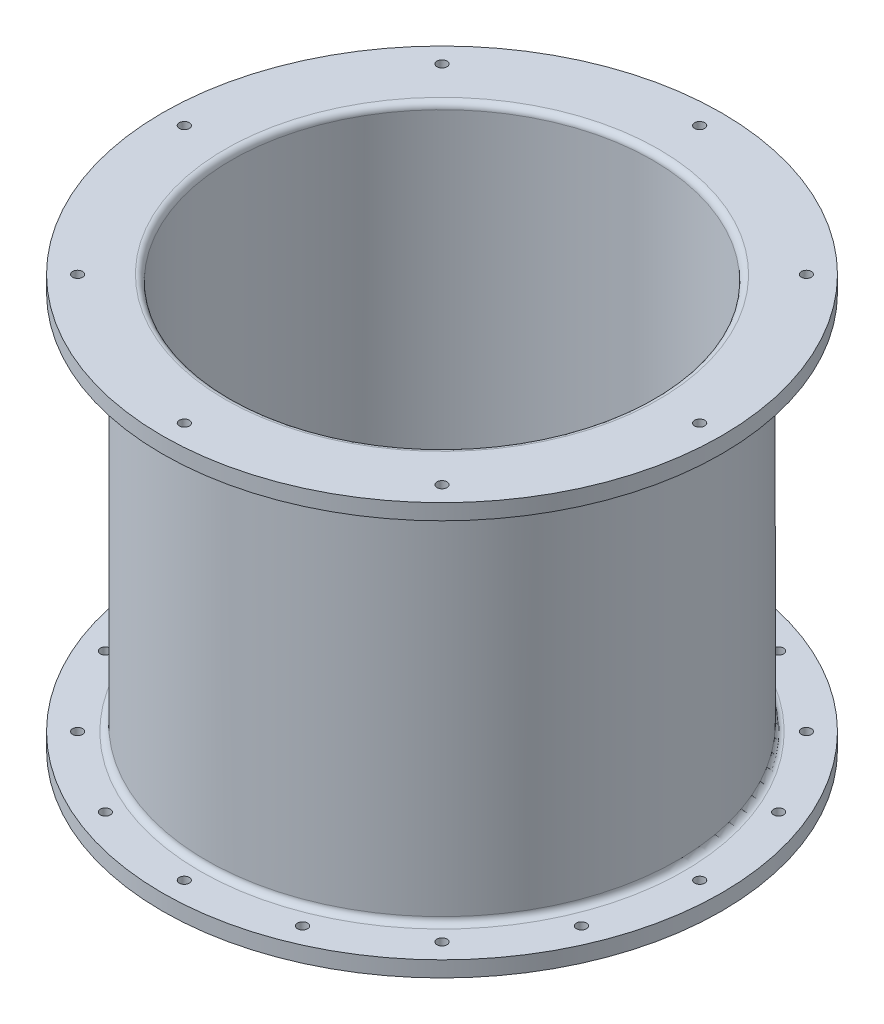
ISO-10303-21;
HEADER;
FILE_DESCRIPTION(('STEP AP214'),'2;1');
FILE_NAME('part.step','',(''),(''),'','','');
FILE_SCHEMA(('AUTOMOTIVE_DESIGN { 1 0 10303 214 1 1 1 1 }'));
ENDSEC;
DATA;
#1=APPLICATION_CONTEXT('core data for automotive mechanical design processes');
#2=APPLICATION_PROTOCOL_DEFINITION('international standard','automotive_design',2000,#1);
#3=PRODUCT_CONTEXT('',#1,'mechanical');
#4=PRODUCT('Part','Part','',(#3));
#5=PRODUCT_RELATED_PRODUCT_CATEGORY('part','',(#4));
#6=PRODUCT_DEFINITION_FORMATION('','',#4);
#7=PRODUCT_DEFINITION_CONTEXT('part definition',#1,'design');
#8=PRODUCT_DEFINITION('design','',#6,#7);
#9=PRODUCT_DEFINITION_SHAPE('','',#8);
#10=(LENGTH_UNIT() NAMED_UNIT(*) SI_UNIT(.MILLI.,.METRE.));
#11=(NAMED_UNIT(*) PLANE_ANGLE_UNIT() SI_UNIT($,.RADIAN.));
#12=(NAMED_UNIT(*) SI_UNIT($,.STERADIAN.) SOLID_ANGLE_UNIT());
#13=UNCERTAINTY_MEASURE_WITH_UNIT(LENGTH_MEASURE(1.E-05),#10,'distance_accuracy_value','');
#14=(GEOMETRIC_REPRESENTATION_CONTEXT(3) GLOBAL_UNCERTAINTY_ASSIGNED_CONTEXT((#13)) GLOBAL_UNIT_ASSIGNED_CONTEXT((#10,
#11,#12)) REPRESENTATION_CONTEXT('',''));
#15=CARTESIAN_POINT('',(0.,0.,0.));
#16=DIRECTION('',(0.,0.,1.));
#17=DIRECTION('',(1.,0.,0.));
#18=AXIS2_PLACEMENT_3D('',#15,#16,#17);
#19=CARTESIAN_POINT('',(0.,6.,0.));
#20=DIRECTION('',(0.,-1.,0.));
#21=DIRECTION('',(0.,0.,-1.));
#22=AXIS2_PLACEMENT_3D('',#19,#20,#21);
#23=CYLINDRICAL_SURFACE('',#22,75.);
#24=CARTESIAN_POINT('',(0.,32.,0.));
#25=DIRECTION('',(0.,-1.,0.));
#26=DIRECTION('',(0.,0.,-1.));
#27=AXIS2_PLACEMENT_3D('',#24,#25,#26);
#28=CIRCLE('',#27,75.);
#29=CARTESIAN_POINT('',(0.,32.,-75.));
#30=VERTEX_POINT('',#29);
#31=EDGE_CURVE('E11',#30,#30,#28,.F.);
#32=ORIENTED_EDGE('',*,*,#31,.T.);
#33=EDGE_LOOP('',(#32));
#34=FACE_BOUND('',#33,.T.);
#35=CARTESIAN_POINT('',(0.,149.,0.));
#36=DIRECTION('',(0.,1.,0.));
#37=DIRECTION('',(0.,0.,1.));
#38=AXIS2_PLACEMENT_3D('',#35,#36,#37);
#39=CIRCLE('',#38,75.);
#40=CARTESIAN_POINT('',(0.,149.,75.));
#41=VERTEX_POINT('',#40);
#42=EDGE_CURVE('E77',#41,#41,#39,.F.);
#43=ORIENTED_EDGE('',*,*,#42,.T.);
#44=EDGE_LOOP('',(#43));
#45=FACE_BOUND('',#44,.T.);
#46=ADVANCED_FACE('F53',(#34,#45),#23,.T.);
#47=CARTESIAN_POINT('',(0.,156.,0.));
#48=DIRECTION('',(0.,-1.,0.));
#49=DIRECTION('',(0.,0.,-1.));
#50=AXIS2_PLACEMENT_3D('',#47,#48,#49);
#51=CYLINDRICAL_SURFACE('',#50,67.);
#52=CARTESIAN_POINT('',(0.,154.,0.));
#53=DIRECTION('',(0.,1.,0.));
#54=DIRECTION('',(0.,0.,1.));
#55=AXIS2_PLACEMENT_3D('',#52,#53,#54);
#56=CIRCLE('',#55,67.);
#57=CARTESIAN_POINT('',(0.,154.,67.));
#58=VERTEX_POINT('',#57);
#59=EDGE_CURVE('E71',#58,#58,#56,.T.);
#60=ORIENTED_EDGE('',*,*,#59,.T.);
#61=EDGE_LOOP('',(#60));
#62=FACE_BOUND('',#61,.T.);
#63=CARTESIAN_POINT('',(0.,25.,0.));
#64=DIRECTION('',(0.,-1.,0.));
#65=DIRECTION('',(0.,0.,-1.));
#66=AXIS2_PLACEMENT_3D('',#63,#64,#65);
#67=CIRCLE('',#66,67.);
#68=CARTESIAN_POINT('',(0.,25.,-67.));
#69=VERTEX_POINT('',#68);
#70=EDGE_CURVE('E154',#69,#69,#67,.T.);
#71=ORIENTED_EDGE('',*,*,#70,.T.);
#72=EDGE_LOOP('',(#71));
#73=FACE_BOUND('',#72,.T.);
#74=ADVANCED_FACE('F356',(#62,#73),#51,.F.);
#75=CARTESIAN_POINT('',(0.,156.,0.));
#76=DIRECTION('',(0.,1.,0.));
#77=DIRECTION('',(0.,0.,1.));
#78=AXIS2_PLACEMENT_3D('',#75,#76,#77);
#79=PLANE('',#78);
#80=CARTESIAN_POINT('',(0.,156.,0.));
#81=DIRECTION('',(0.,1.,0.));
#82=DIRECTION('',(0.,0.,1.));
#83=AXIS2_PLACEMENT_3D('',#80,#81,#82);
#84=CIRCLE('',#83,69.);
#85=CARTESIAN_POINT('',(0.,156.,69.));
#86=VERTEX_POINT('',#85);
#87=EDGE_CURVE('E66',#86,#86,#84,.F.);
#88=ORIENTED_EDGE('',*,*,#87,.T.);
#89=EDGE_LOOP('',(#88));
#90=FACE_BOUND('',#89,.T.);
#91=CARTESIAN_POINT('',(-57.9827560572962,156.,-57.9827560572976));
#92=DIRECTION('',(0.,1.,0.));
#93=DIRECTION('',(0.,0.,1.));
#94=AXIS2_PLACEMENT_3D('',#91,#92,#93);
#95=CIRCLE('',#94,1.60000000000001);
#96=CARTESIAN_POINT('',(-57.9827560572962,156.,-56.3827560572976));
#97=VERTEX_POINT('',#96);
#98=EDGE_CURVE('E150',#97,#97,#95,.T.);
#99=ORIENTED_EDGE('',*,*,#98,.F.);
#100=EDGE_LOOP('',(#99));
#101=FACE_BOUND('',#100,.T.);
#102=CARTESIAN_POINT('',(-82.,156.,-8.58904409355411E-13));
#103=DIRECTION('',(0.,1.,0.));
#104=DIRECTION('',(0.,0.,1.));
#105=AXIS2_PLACEMENT_3D('',#102,#103,#104);
#106=CIRCLE('',#105,1.60000000000001);
#107=CARTESIAN_POINT('',(-82.,156.,1.59999999999915));
#108=VERTEX_POINT('',#107);
#109=EDGE_CURVE('E142',#108,#108,#106,.T.);
#110=ORIENTED_EDGE('',*,*,#109,.F.);
#111=EDGE_LOOP('',(#110));
#112=FACE_BOUND('',#111,.T.);
#113=CARTESIAN_POINT('',(-57.9827560572974,156.,57.9827560572964));
#114=DIRECTION('',(0.,1.,0.));
#115=DIRECTION('',(0.,0.,1.));
#116=AXIS2_PLACEMENT_3D('',#113,#114,#115);
#117=CIRCLE('',#116,1.60000000000001);
#118=CARTESIAN_POINT('',(-57.9827560572974,156.,59.5827560572964));
#119=VERTEX_POINT('',#118);
#120=EDGE_CURVE('E134',#119,#119,#117,.T.);
#121=ORIENTED_EDGE('',*,*,#120,.F.);
#122=EDGE_LOOP('',(#121));
#123=FACE_BOUND('',#122,.T.);
#124=CARTESIAN_POINT('',(-5.72602939570274E-13,156.,82.));
#125=DIRECTION('',(0.,1.,0.));
#126=DIRECTION('',(0.,0.,1.));
#127=AXIS2_PLACEMENT_3D('',#124,#125,#126);
#128=CIRCLE('',#127,1.6);
#129=CARTESIAN_POINT('',(-5.72602939570274E-13,156.,83.6));
#130=VERTEX_POINT('',#129);
#131=EDGE_CURVE('E126',#130,#130,#128,.T.);
#132=ORIENTED_EDGE('',*,*,#131,.F.);
#133=EDGE_LOOP('',(#132));
#134=FACE_BOUND('',#133,.T.);
#135=CARTESIAN_POINT('',(57.9827560572966,156.,57.9827560572972));
#136=DIRECTION('',(0.,1.,0.));
#137=DIRECTION('',(0.,0.,1.));
#138=AXIS2_PLACEMENT_3D('',#135,#136,#137);
#139=CIRCLE('',#138,1.6);
#140=CARTESIAN_POINT('',(57.9827560572966,156.,59.5827560572972));
#141=VERTEX_POINT('',#140);
#142=EDGE_CURVE('E118',#141,#141,#139,.T.);
#143=ORIENTED_EDGE('',*,*,#142,.F.);
#144=EDGE_LOOP('',(#143));
#145=FACE_BOUND('',#144,.T.);
#146=CARTESIAN_POINT('',(82.,156.,2.86301469785137E-13));
#147=DIRECTION('',(0.,1.,0.));
#148=DIRECTION('',(0.,0.,1.));
#149=AXIS2_PLACEMENT_3D('',#146,#147,#148);
#150=CIRCLE('',#149,1.60000000000001);
#151=CARTESIAN_POINT('',(82.,156.,1.60000000000029));
#152=VERTEX_POINT('',#151);
#153=EDGE_CURVE('E110',#152,#152,#150,.T.);
#154=ORIENTED_EDGE('',*,*,#153,.F.);
#155=EDGE_LOOP('',(#154));
#156=FACE_BOUND('',#155,.T.);
#157=CARTESIAN_POINT('',(57.982756057297,156.,-57.9827560572968));
#158=DIRECTION('',(0.,1.,0.));
#159=DIRECTION('',(0.,0.,1.));
#160=AXIS2_PLACEMENT_3D('',#157,#158,#159);
#161=CIRCLE('',#160,1.6);
#162=CARTESIAN_POINT('',(57.982756057297,156.,-56.3827560572968));
#163=VERTEX_POINT('',#162);
#164=EDGE_CURVE('E102',#163,#163,#161,.T.);
#165=ORIENTED_EDGE('',*,*,#164,.F.);
#166=EDGE_LOOP('',(#165));
#167=FACE_BOUND('',#166,.T.);
#168=CARTESIAN_POINT('',(0.,156.,-82.));
#169=DIRECTION('',(0.,1.,0.));
#170=DIRECTION('',(0.,0.,1.));
#171=AXIS2_PLACEMENT_3D('',#168,#169,#170);
#172=CIRCLE('',#171,1.60000000000001);
#173=CARTESIAN_POINT('',(0.,156.,-80.4));
#174=VERTEX_POINT('',#173);
#175=EDGE_CURVE('E94',#174,#174,#172,.T.);
#176=ORIENTED_EDGE('',*,*,#175,.F.);
#177=EDGE_LOOP('',(#176));
#178=FACE_BOUND('',#177,.T.);
#179=CARTESIAN_POINT('',(0.,156.,0.));
#180=DIRECTION('',(0.,1.,0.));
#181=DIRECTION('',(0.,0.,1.));
#182=AXIS2_PLACEMENT_3D('',#179,#180,#181);
#183=CIRCLE('',#182,89.);
#184=CARTESIAN_POINT('',(0.,156.,89.));
#185=VERTEX_POINT('',#184);
#186=EDGE_CURVE('E86',#185,#185,#183,.T.);
#187=ORIENTED_EDGE('',*,*,#186,.T.);
#188=EDGE_LOOP('',(#187));
#189=FACE_BOUND('',#188,.T.);
#190=ADVANCED_FACE('F362',(#90,#101,#112,#123,#134,#145,#156,#167,#178,#189),#79,.T.);
#191=CARTESIAN_POINT('',(0.,151.,0.));
#192=DIRECTION('',(0.,1.,0.));
#193=DIRECTION('',(0.,0.,1.));
#194=AXIS2_PLACEMENT_3D('',#191,#192,#193);
#195=CYLINDRICAL_SURFACE('',#194,89.);
#196=CARTESIAN_POINT('',(0.,151.,0.));
#197=DIRECTION('',(0.,1.,0.));
#198=DIRECTION('',(0.,0.,1.));
#199=AXIS2_PLACEMENT_3D('',#196,#197,#198);
#200=CIRCLE('',#199,89.);
#201=CARTESIAN_POINT('',(0.,151.,89.));
#202=VERTEX_POINT('',#201);
#203=EDGE_CURVE('E85',#202,#202,#200,.T.);
#204=ORIENTED_EDGE('',*,*,#203,.T.);
#205=EDGE_LOOP('',(#204));
#206=FACE_BOUND('',#205,.T.);
#207=ORIENTED_EDGE('',*,*,#186,.F.);
#208=EDGE_LOOP('',(#207));
#209=FACE_BOUND('',#208,.T.);
#210=ADVANCED_FACE('F385',(#206,#209),#195,.T.);
#211=CARTESIAN_POINT('',(0.,151.,0.));
#212=DIRECTION('',(0.,1.,0.));
#213=DIRECTION('',(0.,0.,1.));
#214=AXIS2_PLACEMENT_3D('',#211,#212,#213);
#215=PLANE('',#214);
#216=CARTESIAN_POINT('',(0.,151.,0.));
#217=DIRECTION('',(0.,1.,0.));
#218=DIRECTION('',(0.,0.,1.));
#219=AXIS2_PLACEMENT_3D('',#216,#217,#218);
#220=CIRCLE('',#219,77.);
#221=CARTESIAN_POINT('',(0.,151.,77.));
#222=VERTEX_POINT('',#221);
#223=EDGE_CURVE('E81',#222,#222,#220,.T.);
#224=ORIENTED_EDGE('',*,*,#223,.T.);
#225=EDGE_LOOP('',(#224));
#226=FACE_BOUND('',#225,.T.);
#227=CARTESIAN_POINT('',(-57.9827560572962,151.,-57.9827560572976));
#228=DIRECTION('',(0.,1.,0.));
#229=DIRECTION('',(0.,0.,1.));
#230=AXIS2_PLACEMENT_3D('',#227,#228,#229);
#231=CIRCLE('',#230,1.60000000000001);
#232=CARTESIAN_POINT('',(-57.9827560572962,151.,-56.3827560572976));
#233=VERTEX_POINT('',#232);
#234=EDGE_CURVE('E146',#233,#233,#231,.T.);
#235=ORIENTED_EDGE('',*,*,#234,.T.);
#236=EDGE_LOOP('',(#235));
#237=FACE_BOUND('',#236,.T.);
#238=CARTESIAN_POINT('',(-82.,151.,-8.58904409355411E-13));
#239=DIRECTION('',(0.,1.,0.));
#240=DIRECTION('',(0.,0.,1.));
#241=AXIS2_PLACEMENT_3D('',#238,#239,#240);
#242=CIRCLE('',#241,1.60000000000001);
#243=CARTESIAN_POINT('',(-82.,151.,1.59999999999915));
#244=VERTEX_POINT('',#243);
#245=EDGE_CURVE('E138',#244,#244,#242,.T.);
#246=ORIENTED_EDGE('',*,*,#245,.T.);
#247=EDGE_LOOP('',(#246));
#248=FACE_BOUND('',#247,.T.);
#249=CARTESIAN_POINT('',(-57.9827560572974,151.,57.9827560572964));
#250=DIRECTION('',(0.,1.,0.));
#251=DIRECTION('',(0.,0.,1.));
#252=AXIS2_PLACEMENT_3D('',#249,#250,#251);
#253=CIRCLE('',#252,1.60000000000001);
#254=CARTESIAN_POINT('',(-57.9827560572974,151.,59.5827560572964));
#255=VERTEX_POINT('',#254);
#256=EDGE_CURVE('E130',#255,#255,#253,.T.);
#257=ORIENTED_EDGE('',*,*,#256,.T.);
#258=EDGE_LOOP('',(#257));
#259=FACE_BOUND('',#258,.T.);
#260=CARTESIAN_POINT('',(-5.72602939570274E-13,151.,82.));
#261=DIRECTION('',(0.,1.,0.));
#262=DIRECTION('',(0.,0.,1.));
#263=AXIS2_PLACEMENT_3D('',#260,#261,#262);
#264=CIRCLE('',#263,1.6);
#265=CARTESIAN_POINT('',(-5.72602939570274E-13,151.,83.6));
#266=VERTEX_POINT('',#265);
#267=EDGE_CURVE('E122',#266,#266,#264,.T.);
#268=ORIENTED_EDGE('',*,*,#267,.T.);
#269=EDGE_LOOP('',(#268));
#270=FACE_BOUND('',#269,.T.);
#271=CARTESIAN_POINT('',(57.9827560572966,151.,57.9827560572972));
#272=DIRECTION('',(0.,1.,0.));
#273=DIRECTION('',(0.,0.,1.));
#274=AXIS2_PLACEMENT_3D('',#271,#272,#273);
#275=CIRCLE('',#274,1.6);
#276=CARTESIAN_POINT('',(57.9827560572966,151.,59.5827560572972));
#277=VERTEX_POINT('',#276);
#278=EDGE_CURVE('E114',#277,#277,#275,.T.);
#279=ORIENTED_EDGE('',*,*,#278,.T.);
#280=EDGE_LOOP('',(#279));
#281=FACE_BOUND('',#280,.T.);
#282=CARTESIAN_POINT('',(82.,151.,2.86301469785137E-13));
#283=DIRECTION('',(0.,1.,0.));
#284=DIRECTION('',(0.,0.,1.));
#285=AXIS2_PLACEMENT_3D('',#282,#283,#284);
#286=CIRCLE('',#285,1.60000000000001);
#287=CARTESIAN_POINT('',(82.,151.,1.60000000000029));
#288=VERTEX_POINT('',#287);
#289=EDGE_CURVE('E106',#288,#288,#286,.T.);
#290=ORIENTED_EDGE('',*,*,#289,.T.);
#291=EDGE_LOOP('',(#290));
#292=FACE_BOUND('',#291,.T.);
#293=CARTESIAN_POINT('',(57.982756057297,151.,-57.9827560572968));
#294=DIRECTION('',(0.,1.,0.));
#295=DIRECTION('',(0.,0.,1.));
#296=AXIS2_PLACEMENT_3D('',#293,#294,#295);
#297=CIRCLE('',#296,1.6);
#298=CARTESIAN_POINT('',(57.982756057297,151.,-56.3827560572968));
#299=VERTEX_POINT('',#298);
#300=EDGE_CURVE('E98',#299,#299,#297,.T.);
#301=ORIENTED_EDGE('',*,*,#300,.T.);
#302=EDGE_LOOP('',(#301));
#303=FACE_BOUND('',#302,.T.);
#304=CARTESIAN_POINT('',(0.,151.,-82.));
#305=DIRECTION('',(0.,1.,0.));
#306=DIRECTION('',(0.,0.,1.));
#307=AXIS2_PLACEMENT_3D('',#304,#305,#306);
#308=CIRCLE('',#307,1.60000000000001);
#309=CARTESIAN_POINT('',(0.,151.,-80.4));
#310=VERTEX_POINT('',#309);
#311=EDGE_CURVE('E90',#310,#310,#308,.T.);
#312=ORIENTED_EDGE('',*,*,#311,.T.);
#313=EDGE_LOOP('',(#312));
#314=FACE_BOUND('',#313,.T.);
#315=ORIENTED_EDGE('',*,*,#203,.F.);
#316=EDGE_LOOP('',(#315));
#317=FACE_BOUND('',#316,.T.);
#318=ADVANCED_FACE('F405',(#226,#237,#248,#259,#270,#281,#292,#303,#314,#317),#215,.F.);
#319=CARTESIAN_POINT('',(0.,151.,-82.));
#320=DIRECTION('',(0.,1.,0.));
#321=DIRECTION('',(0.,0.,1.));
#322=AXIS2_PLACEMENT_3D('',#319,#320,#321);
#323=CYLINDRICAL_SURFACE('',#322,1.60000000000001);
#324=ORIENTED_EDGE('',*,*,#311,.F.);
#325=EDGE_LOOP('',(#324));
#326=FACE_BOUND('',#325,.T.);
#327=ORIENTED_EDGE('',*,*,#175,.T.);
#328=EDGE_LOOP('',(#327));
#329=FACE_BOUND('',#328,.T.);
#330=ADVANCED_FACE('F411',(#326,#329),#323,.F.);
#331=CARTESIAN_POINT('',(57.982756057297,151.,-57.9827560572968));
#332=DIRECTION('',(0.,1.,0.));
#333=DIRECTION('',(0.,0.,1.));
#334=AXIS2_PLACEMENT_3D('',#331,#332,#333);
#335=CYLINDRICAL_SURFACE('',#334,1.6);
#336=ORIENTED_EDGE('',*,*,#300,.F.);
#337=EDGE_LOOP('',(#336));
#338=FACE_BOUND('',#337,.T.);
#339=ORIENTED_EDGE('',*,*,#164,.T.);
#340=EDGE_LOOP('',(#339));
#341=FACE_BOUND('',#340,.T.);
#342=ADVANCED_FACE('F417',(#338,#341),#335,.F.);
#343=CARTESIAN_POINT('',(82.,151.,2.86301469785137E-13));
#344=DIRECTION('',(0.,1.,0.));
#345=DIRECTION('',(0.,0.,1.));
#346=AXIS2_PLACEMENT_3D('',#343,#344,#345);
#347=CYLINDRICAL_SURFACE('',#346,1.60000000000001);
#348=ORIENTED_EDGE('',*,*,#289,.F.);
#349=EDGE_LOOP('',(#348));
#350=FACE_BOUND('',#349,.T.);
#351=ORIENTED_EDGE('',*,*,#153,.T.);
#352=EDGE_LOOP('',(#351));
#353=FACE_BOUND('',#352,.T.);
#354=ADVANCED_FACE('F421',(#350,#353),#347,.F.);
#355=CARTESIAN_POINT('',(57.9827560572966,151.,57.9827560572972));
#356=DIRECTION('',(0.,1.,0.));
#357=DIRECTION('',(0.,0.,1.));
#358=AXIS2_PLACEMENT_3D('',#355,#356,#357);
#359=CYLINDRICAL_SURFACE('',#358,1.6);
#360=ORIENTED_EDGE('',*,*,#278,.F.);
#361=EDGE_LOOP('',(#360));
#362=FACE_BOUND('',#361,.T.);
#363=ORIENTED_EDGE('',*,*,#142,.T.);
#364=EDGE_LOOP('',(#363));
#365=FACE_BOUND('',#364,.T.);
#366=ADVANCED_FACE('F425',(#362,#365),#359,.F.);
#367=CARTESIAN_POINT('',(-5.72602939570274E-13,151.,82.));
#368=DIRECTION('',(0.,1.,0.));
#369=DIRECTION('',(0.,0.,1.));
#370=AXIS2_PLACEMENT_3D('',#367,#368,#369);
#371=CYLINDRICAL_SURFACE('',#370,1.6);
#372=ORIENTED_EDGE('',*,*,#267,.F.);
#373=EDGE_LOOP('',(#372));
#374=FACE_BOUND('',#373,.T.);
#375=ORIENTED_EDGE('',*,*,#131,.T.);
#376=EDGE_LOOP('',(#375));
#377=FACE_BOUND('',#376,.T.);
#378=ADVANCED_FACE('F429',(#374,#377),#371,.F.);
#379=CARTESIAN_POINT('',(-57.9827560572974,151.,57.9827560572964));
#380=DIRECTION('',(0.,1.,0.));
#381=DIRECTION('',(0.,0.,1.));
#382=AXIS2_PLACEMENT_3D('',#379,#380,#381);
#383=CYLINDRICAL_SURFACE('',#382,1.60000000000001);
#384=ORIENTED_EDGE('',*,*,#256,.F.);
#385=EDGE_LOOP('',(#384));
#386=FACE_BOUND('',#385,.T.);
#387=ORIENTED_EDGE('',*,*,#120,.T.);
#388=EDGE_LOOP('',(#387));
#389=FACE_BOUND('',#388,.T.);
#390=ADVANCED_FACE('F433',(#386,#389),#383,.F.);
#391=CARTESIAN_POINT('',(-82.,151.,-8.58904409355411E-13));
#392=DIRECTION('',(0.,1.,0.));
#393=DIRECTION('',(0.,0.,1.));
#394=AXIS2_PLACEMENT_3D('',#391,#392,#393);
#395=CYLINDRICAL_SURFACE('',#394,1.60000000000001);
#396=ORIENTED_EDGE('',*,*,#245,.F.);
#397=EDGE_LOOP('',(#396));
#398=FACE_BOUND('',#397,.T.);
#399=ORIENTED_EDGE('',*,*,#109,.T.);
#400=EDGE_LOOP('',(#399));
#401=FACE_BOUND('',#400,.T.);
#402=ADVANCED_FACE('F437',(#398,#401),#395,.F.);
#403=CARTESIAN_POINT('',(-57.9827560572962,151.,-57.9827560572976));
#404=DIRECTION('',(0.,1.,0.));
#405=DIRECTION('',(0.,0.,1.));
#406=AXIS2_PLACEMENT_3D('',#403,#404,#405);
#407=CYLINDRICAL_SURFACE('',#406,1.60000000000001);
#408=ORIENTED_EDGE('',*,*,#234,.F.);
#409=EDGE_LOOP('',(#408));
#410=FACE_BOUND('',#409,.T.);
#411=ORIENTED_EDGE('',*,*,#98,.T.);
#412=EDGE_LOOP('',(#411));
#413=FACE_BOUND('',#412,.T.);
#414=ADVANCED_FACE('F370',(#410,#413),#407,.F.);
#415=CARTESIAN_POINT('',(0.,149.,0.));
#416=DIRECTION('',(0.,1.,0.));
#417=DIRECTION('',(0.,0.,1.));
#418=AXIS2_PLACEMENT_3D('',#415,#416,#417);
#419=TOROIDAL_SURFACE('',#418,77.,2.);
#420=ORIENTED_EDGE('',*,*,#42,.F.);
#421=EDGE_LOOP('',(#420));
#422=FACE_BOUND('',#421,.T.);
#423=ORIENTED_EDGE('',*,*,#223,.F.);
#424=EDGE_LOOP('',(#423));
#425=FACE_BOUND('',#424,.T.);
#426=ADVANCED_FACE('F368',(#422,#425),#419,.F.);
#427=CARTESIAN_POINT('',(0.,154.,0.));
#428=DIRECTION('',(0.,1.,0.));
#429=DIRECTION('',(0.,0.,1.));
#430=AXIS2_PLACEMENT_3D('',#427,#428,#429);
#431=TOROIDAL_SURFACE('',#430,69.,2.);
#432=ORIENTED_EDGE('',*,*,#87,.F.);
#433=EDGE_LOOP('',(#432));
#434=FACE_BOUND('',#433,.T.);
#435=ORIENTED_EDGE('',*,*,#59,.F.);
#436=EDGE_LOOP('',(#435));
#437=FACE_BOUND('',#436,.T.);
#438=ADVANCED_FACE('F312',(#434,#437),#431,.T.);
#439=CARTESIAN_POINT('',(0.,25.,0.));
#440=DIRECTION('',(0.,-1.,0.));
#441=DIRECTION('',(0.,0.,-1.));
#442=AXIS2_PLACEMENT_3D('',#439,#440,#441);
#443=PLANE('',#442);
#444=ORIENTED_EDGE('',*,*,#70,.F.);
#445=EDGE_LOOP('',(#444));
#446=FACE_BOUND('',#445,.T.);
#447=CARTESIAN_POINT('',(-31.3800414539374,25.,75.7581216659255));
#448=DIRECTION('',(0.,-1.,0.));
#449=DIRECTION('',(0.,0.,-1.));
#450=AXIS2_PLACEMENT_3D('',#447,#448,#449);
#451=CIRCLE('',#450,1.6);
#452=CARTESIAN_POINT('',(-31.3800414539374,25.,74.1581216659255));
#453=VERTEX_POINT('',#452);
#454=EDGE_CURVE('E290',#453,#453,#451,.T.);
#455=ORIENTED_EDGE('',*,*,#454,.F.);
#456=EDGE_LOOP('',(#455));
#457=FACE_BOUND('',#456,.T.);
#458=CARTESIAN_POINT('',(-57.9827560572969,25.,57.9827560572969));
#459=DIRECTION('',(0.,-1.,0.));
#460=DIRECTION('',(0.,0.,-1.));
#461=AXIS2_PLACEMENT_3D('',#458,#459,#460);
#462=CIRCLE('',#461,1.60000000000001);
#463=CARTESIAN_POINT('',(-57.9827560572969,25.,56.3827560572969));
#464=VERTEX_POINT('',#463);
#465=EDGE_CURVE('E282',#464,#464,#462,.T.);
#466=ORIENTED_EDGE('',*,*,#465,.F.);
#467=EDGE_LOOP('',(#466));
#468=FACE_BOUND('',#467,.T.);
#469=CARTESIAN_POINT('',(-75.7581216659255,25.,31.3800414539374));
#470=DIRECTION('',(0.,-1.,0.));
#471=DIRECTION('',(0.,0.,-1.));
#472=AXIS2_PLACEMENT_3D('',#469,#470,#471);
#473=CIRCLE('',#472,1.60000000000001);
#474=CARTESIAN_POINT('',(-75.7581216659255,25.,29.7800414539374));
#475=VERTEX_POINT('',#474);
#476=EDGE_CURVE('E274',#475,#475,#473,.T.);
#477=ORIENTED_EDGE('',*,*,#476,.F.);
#478=EDGE_LOOP('',(#477));
#479=FACE_BOUND('',#478,.T.);
#480=CARTESIAN_POINT('',(-82.,25.,0.));
#481=DIRECTION('',(0.,-1.,0.));
#482=DIRECTION('',(0.,0.,-1.));
#483=AXIS2_PLACEMENT_3D('',#480,#481,#482);
#484=CIRCLE('',#483,1.60000000000001);
#485=CARTESIAN_POINT('',(-82.,25.,-1.60000000000002));
#486=VERTEX_POINT('',#485);
#487=EDGE_CURVE('E266',#486,#486,#484,.T.);
#488=ORIENTED_EDGE('',*,*,#487,.F.);
#489=EDGE_LOOP('',(#488));
#490=FACE_BOUND('',#489,.T.);
#491=CARTESIAN_POINT('',(-75.7581216659255,25.,-31.3800414539374));
#492=DIRECTION('',(0.,-1.,0.));
#493=DIRECTION('',(0.,0.,-1.));
#494=AXIS2_PLACEMENT_3D('',#491,#492,#493);
#495=CIRCLE('',#494,1.6);
#496=CARTESIAN_POINT('',(-75.7581216659255,25.,-32.9800414539374));
#497=VERTEX_POINT('',#496);
#498=EDGE_CURVE('E258',#497,#497,#495,.T.);
#499=ORIENTED_EDGE('',*,*,#498,.F.);
#500=EDGE_LOOP('',(#499));
#501=FACE_BOUND('',#500,.T.);
#502=CARTESIAN_POINT('',(-57.9827560572969,25.,-57.9827560572969));
#503=DIRECTION('',(0.,-1.,0.));
#504=DIRECTION('',(0.,0.,-1.));
#505=AXIS2_PLACEMENT_3D('',#502,#503,#504);
#506=CIRCLE('',#505,1.60000000000001);
#507=CARTESIAN_POINT('',(-57.9827560572969,25.,-59.5827560572969));
#508=VERTEX_POINT('',#507);
#509=EDGE_CURVE('E250',#508,#508,#506,.T.);
#510=ORIENTED_EDGE('',*,*,#509,.F.);
#511=EDGE_LOOP('',(#510));
#512=FACE_BOUND('',#511,.T.);
#513=CARTESIAN_POINT('',(-31.3800414539374,25.,-75.7581216659255));
#514=DIRECTION('',(0.,-1.,0.));
#515=DIRECTION('',(0.,0.,-1.));
#516=AXIS2_PLACEMENT_3D('',#513,#514,#515);
#517=CIRCLE('',#516,1.60000000000001);
#518=CARTESIAN_POINT('',(-31.3800414539374,25.,-77.3581216659256));
#519=VERTEX_POINT('',#518);
#520=EDGE_CURVE('E242',#519,#519,#517,.T.);
#521=ORIENTED_EDGE('',*,*,#520,.F.);
#522=EDGE_LOOP('',(#521));
#523=FACE_BOUND('',#522,.T.);
#524=CARTESIAN_POINT('',(0.,25.,-82.));
#525=DIRECTION('',(0.,-1.,0.));
#526=DIRECTION('',(0.,0.,-1.));
#527=AXIS2_PLACEMENT_3D('',#524,#525,#526);
#528=CIRCLE('',#527,1.6);
#529=CARTESIAN_POINT('',(0.,25.,-83.6));
#530=VERTEX_POINT('',#529);
#531=EDGE_CURVE('E234',#530,#530,#528,.T.);
#532=ORIENTED_EDGE('',*,*,#531,.F.);
#533=EDGE_LOOP('',(#532));
#534=FACE_BOUND('',#533,.T.);
#535=CARTESIAN_POINT('',(31.3800414539374,25.,-75.7581216659255));
#536=DIRECTION('',(0.,-1.,0.));
#537=DIRECTION('',(0.,0.,-1.));
#538=AXIS2_PLACEMENT_3D('',#535,#536,#537);
#539=CIRCLE('',#538,1.6);
#540=CARTESIAN_POINT('',(31.3800414539374,25.,-77.3581216659255));
#541=VERTEX_POINT('',#540);
#542=EDGE_CURVE('E226',#541,#541,#539,.T.);
#543=ORIENTED_EDGE('',*,*,#542,.F.);
#544=EDGE_LOOP('',(#543));
#545=FACE_BOUND('',#544,.T.);
#546=CARTESIAN_POINT('',(57.9827560572969,25.,-57.9827560572969));
#547=DIRECTION('',(0.,-1.,0.));
#548=DIRECTION('',(0.,0.,-1.));
#549=AXIS2_PLACEMENT_3D('',#546,#547,#548);
#550=CIRCLE('',#549,1.6);
#551=CARTESIAN_POINT('',(57.9827560572969,25.,-59.5827560572969));
#552=VERTEX_POINT('',#551);
#553=EDGE_CURVE('E218',#552,#552,#550,.T.);
#554=ORIENTED_EDGE('',*,*,#553,.F.);
#555=EDGE_LOOP('',(#554));
#556=FACE_BOUND('',#555,.T.);
#557=CARTESIAN_POINT('',(75.7581216659255,25.,-31.3800414539374));
#558=DIRECTION('',(0.,-1.,0.));
#559=DIRECTION('',(0.,0.,-1.));
#560=AXIS2_PLACEMENT_3D('',#557,#558,#559);
#561=CIRCLE('',#560,1.6);
#562=CARTESIAN_POINT('',(75.7581216659255,25.,-32.9800414539374));
#563=VERTEX_POINT('',#562);
#564=EDGE_CURVE('E210',#563,#563,#561,.T.);
#565=ORIENTED_EDGE('',*,*,#564,.F.);
#566=EDGE_LOOP('',(#565));
#567=FACE_BOUND('',#566,.T.);
#568=CARTESIAN_POINT('',(82.,25.,0.));
#569=DIRECTION('',(0.,-1.,0.));
#570=DIRECTION('',(0.,0.,-1.));
#571=AXIS2_PLACEMENT_3D('',#568,#569,#570);
#572=CIRCLE('',#571,1.60000000000001);
#573=CARTESIAN_POINT('',(82.,25.,-1.6));
#574=VERTEX_POINT('',#573);
#575=EDGE_CURVE('E202',#574,#574,#572,.T.);
#576=ORIENTED_EDGE('',*,*,#575,.F.);
#577=EDGE_LOOP('',(#576));
#578=FACE_BOUND('',#577,.T.);
#579=CARTESIAN_POINT('',(75.7581216659255,25.,31.3800414539374));
#580=DIRECTION('',(0.,-1.,0.));
#581=DIRECTION('',(0.,0.,-1.));
#582=AXIS2_PLACEMENT_3D('',#579,#580,#581);
#583=CIRCLE('',#582,1.60000000000001);
#584=CARTESIAN_POINT('',(75.7581216659255,25.,29.7800414539374));
#585=VERTEX_POINT('',#584);
#586=EDGE_CURVE('E194',#585,#585,#583,.T.);
#587=ORIENTED_EDGE('',*,*,#586,.F.);
#588=EDGE_LOOP('',(#587));
#589=FACE_BOUND('',#588,.T.);
#590=CARTESIAN_POINT('',(57.9827560572969,25.,57.9827560572969));
#591=DIRECTION('',(0.,-1.,0.));
#592=DIRECTION('',(0.,0.,-1.));
#593=AXIS2_PLACEMENT_3D('',#590,#591,#592);
#594=CIRCLE('',#593,1.6);
#595=CARTESIAN_POINT('',(57.9827560572969,25.,56.3827560572969));
#596=VERTEX_POINT('',#595);
#597=EDGE_CURVE('E186',#596,#596,#594,.T.);
#598=ORIENTED_EDGE('',*,*,#597,.F.);
#599=EDGE_LOOP('',(#598));
#600=FACE_BOUND('',#599,.T.);
#601=CARTESIAN_POINT('',(31.3800414539373,25.,75.7581216659256));
#602=DIRECTION('',(0.,-1.,0.));
#603=DIRECTION('',(0.,0.,-1.));
#604=AXIS2_PLACEMENT_3D('',#601,#602,#603);
#605=CIRCLE('',#604,1.6);
#606=CARTESIAN_POINT('',(31.3800414539373,25.,74.1581216659256));
#607=VERTEX_POINT('',#606);
#608=EDGE_CURVE('E178',#607,#607,#605,.T.);
#609=ORIENTED_EDGE('',*,*,#608,.F.);
#610=EDGE_LOOP('',(#609));
#611=FACE_BOUND('',#610,.T.);
#612=CARTESIAN_POINT('',(0.,25.,82.));
#613=DIRECTION('',(0.,-1.,0.));
#614=DIRECTION('',(0.,0.,-1.));
#615=AXIS2_PLACEMENT_3D('',#612,#613,#614);
#616=CIRCLE('',#615,1.6);
#617=CARTESIAN_POINT('',(0.,25.,80.4));
#618=VERTEX_POINT('',#617);
#619=EDGE_CURVE('E170',#618,#618,#616,.T.);
#620=ORIENTED_EDGE('',*,*,#619,.F.);
#621=EDGE_LOOP('',(#620));
#622=FACE_BOUND('',#621,.T.);
#623=CARTESIAN_POINT('',(0.,25.,0.));
#624=DIRECTION('',(0.,-1.,0.));
#625=DIRECTION('',(0.,0.,-1.));
#626=AXIS2_PLACEMENT_3D('',#623,#624,#625);
#627=CIRCLE('',#626,89.);
#628=CARTESIAN_POINT('',(0.,25.,-89.));
#629=VERTEX_POINT('',#628);
#630=EDGE_CURVE('E162',#629,#629,#627,.T.);
#631=ORIENTED_EDGE('',*,*,#630,.T.);
#632=EDGE_LOOP('',(#631));
#633=FACE_BOUND('',#632,.T.);
#634=ADVANCED_FACE('F308',(#446,#457,#468,#479,#490,#501,#512,#523,#534,#545,#556,#567,#578,
#589,#600,#611,#622,#633),#443,.T.);
#635=CARTESIAN_POINT('',(0.,30.,0.));
#636=DIRECTION('',(0.,-1.,0.));
#637=DIRECTION('',(0.,0.,-1.));
#638=AXIS2_PLACEMENT_3D('',#635,#636,#637);
#639=CYLINDRICAL_SURFACE('',#638,89.);
#640=CARTESIAN_POINT('',(0.,30.,0.));
#641=DIRECTION('',(0.,-1.,0.));
#642=DIRECTION('',(0.,0.,-1.));
#643=AXIS2_PLACEMENT_3D('',#640,#641,#642);
#644=CIRCLE('',#643,89.);
#645=CARTESIAN_POINT('',(0.,30.,-89.));
#646=VERTEX_POINT('',#645);
#647=EDGE_CURVE('E161',#646,#646,#644,.T.);
#648=ORIENTED_EDGE('',*,*,#647,.T.);
#649=EDGE_LOOP('',(#648));
#650=FACE_BOUND('',#649,.T.);
#651=ORIENTED_EDGE('',*,*,#630,.F.);
#652=EDGE_LOOP('',(#651));
#653=FACE_BOUND('',#652,.T.);
#654=ADVANCED_FACE('F311',(#650,#653),#639,.T.);
#655=CARTESIAN_POINT('',(0.,30.,0.));
#656=DIRECTION('',(0.,-1.,0.));
#657=DIRECTION('',(0.,0.,-1.));
#658=AXIS2_PLACEMENT_3D('',#655,#656,#657);
#659=PLANE('',#658);
#660=CARTESIAN_POINT('',(0.,30.,0.));
#661=DIRECTION('',(0.,-1.,0.));
#662=DIRECTION('',(0.,0.,-1.));
#663=AXIS2_PLACEMENT_3D('',#660,#661,#662);
#664=CIRCLE('',#663,77.);
#665=CARTESIAN_POINT('',(0.,30.,-77.));
#666=VERTEX_POINT('',#665);
#667=EDGE_CURVE('E61',#666,#666,#664,.T.);
#668=ORIENTED_EDGE('',*,*,#667,.T.);
#669=EDGE_LOOP('',(#668));
#670=FACE_BOUND('',#669,.T.);
#671=CARTESIAN_POINT('',(-31.3800414539374,30.,75.7581216659255));
#672=DIRECTION('',(0.,-1.,0.));
#673=DIRECTION('',(0.,0.,-1.));
#674=AXIS2_PLACEMENT_3D('',#671,#672,#673);
#675=CIRCLE('',#674,1.6);
#676=CARTESIAN_POINT('',(-31.3800414539374,30.,74.1581216659255));
#677=VERTEX_POINT('',#676);
#678=EDGE_CURVE('E286',#677,#677,#675,.T.);
#679=ORIENTED_EDGE('',*,*,#678,.T.);
#680=EDGE_LOOP('',(#679));
#681=FACE_BOUND('',#680,.T.);
#682=CARTESIAN_POINT('',(-57.9827560572969,30.,57.9827560572969));
#683=DIRECTION('',(0.,-1.,0.));
#684=DIRECTION('',(0.,0.,-1.));
#685=AXIS2_PLACEMENT_3D('',#682,#683,#684);
#686=CIRCLE('',#685,1.60000000000001);
#687=CARTESIAN_POINT('',(-57.9827560572969,30.,56.3827560572969));
#688=VERTEX_POINT('',#687);
#689=EDGE_CURVE('E278',#688,#688,#686,.T.);
#690=ORIENTED_EDGE('',*,*,#689,.T.);
#691=EDGE_LOOP('',(#690));
#692=FACE_BOUND('',#691,.T.);
#693=CARTESIAN_POINT('',(-75.7581216659255,30.,31.3800414539374));
#694=DIRECTION('',(0.,-1.,0.));
#695=DIRECTION('',(0.,0.,-1.));
#696=AXIS2_PLACEMENT_3D('',#693,#694,#695);
#697=CIRCLE('',#696,1.60000000000001);
#698=CARTESIAN_POINT('',(-75.7581216659255,30.,29.7800414539374));
#699=VERTEX_POINT('',#698);
#700=EDGE_CURVE('E270',#699,#699,#697,.T.);
#701=ORIENTED_EDGE('',*,*,#700,.T.);
#702=EDGE_LOOP('',(#701));
#703=FACE_BOUND('',#702,.T.);
#704=CARTESIAN_POINT('',(-82.,30.,0.));
#705=DIRECTION('',(0.,-1.,0.));
#706=DIRECTION('',(0.,0.,-1.));
#707=AXIS2_PLACEMENT_3D('',#704,#705,#706);
#708=CIRCLE('',#707,1.60000000000001);
#709=CARTESIAN_POINT('',(-82.,30.,-1.60000000000002));
#710=VERTEX_POINT('',#709);
#711=EDGE_CURVE('E262',#710,#710,#708,.T.);
#712=ORIENTED_EDGE('',*,*,#711,.T.);
#713=EDGE_LOOP('',(#712));
#714=FACE_BOUND('',#713,.T.);
#715=CARTESIAN_POINT('',(-75.7581216659255,30.,-31.3800414539374));
#716=DIRECTION('',(0.,-1.,0.));
#717=DIRECTION('',(0.,0.,-1.));
#718=AXIS2_PLACEMENT_3D('',#715,#716,#717);
#719=CIRCLE('',#718,1.6);
#720=CARTESIAN_POINT('',(-75.7581216659255,30.,-32.9800414539374));
#721=VERTEX_POINT('',#720);
#722=EDGE_CURVE('E254',#721,#721,#719,.T.);
#723=ORIENTED_EDGE('',*,*,#722,.T.);
#724=EDGE_LOOP('',(#723));
#725=FACE_BOUND('',#724,.T.);
#726=CARTESIAN_POINT('',(-57.9827560572969,30.,-57.9827560572969));
#727=DIRECTION('',(0.,-1.,0.));
#728=DIRECTION('',(0.,0.,-1.));
#729=AXIS2_PLACEMENT_3D('',#726,#727,#728);
#730=CIRCLE('',#729,1.60000000000001);
#731=CARTESIAN_POINT('',(-57.9827560572969,30.,-59.5827560572969));
#732=VERTEX_POINT('',#731);
#733=EDGE_CURVE('E246',#732,#732,#730,.T.);
#734=ORIENTED_EDGE('',*,*,#733,.T.);
#735=EDGE_LOOP('',(#734));
#736=FACE_BOUND('',#735,.T.);
#737=CARTESIAN_POINT('',(-31.3800414539374,30.,-75.7581216659255));
#738=DIRECTION('',(0.,-1.,0.));
#739=DIRECTION('',(0.,0.,-1.));
#740=AXIS2_PLACEMENT_3D('',#737,#738,#739);
#741=CIRCLE('',#740,1.60000000000001);
#742=CARTESIAN_POINT('',(-31.3800414539374,30.,-77.3581216659256));
#743=VERTEX_POINT('',#742);
#744=EDGE_CURVE('E238',#743,#743,#741,.T.);
#745=ORIENTED_EDGE('',*,*,#744,.T.);
#746=EDGE_LOOP('',(#745));
#747=FACE_BOUND('',#746,.T.);
#748=CARTESIAN_POINT('',(0.,30.,-82.));
#749=DIRECTION('',(0.,-1.,0.));
#750=DIRECTION('',(0.,0.,-1.));
#751=AXIS2_PLACEMENT_3D('',#748,#749,#750);
#752=CIRCLE('',#751,1.6);
#753=CARTESIAN_POINT('',(0.,30.,-83.6));
#754=VERTEX_POINT('',#753);
#755=EDGE_CURVE('E230',#754,#754,#752,.T.);
#756=ORIENTED_EDGE('',*,*,#755,.T.);
#757=EDGE_LOOP('',(#756));
#758=FACE_BOUND('',#757,.T.);
#759=CARTESIAN_POINT('',(31.3800414539374,30.,-75.7581216659255));
#760=DIRECTION('',(0.,-1.,0.));
#761=DIRECTION('',(0.,0.,-1.));
#762=AXIS2_PLACEMENT_3D('',#759,#760,#761);
#763=CIRCLE('',#762,1.6);
#764=CARTESIAN_POINT('',(31.3800414539374,30.,-77.3581216659255));
#765=VERTEX_POINT('',#764);
#766=EDGE_CURVE('E222',#765,#765,#763,.T.);
#767=ORIENTED_EDGE('',*,*,#766,.T.);
#768=EDGE_LOOP('',(#767));
#769=FACE_BOUND('',#768,.T.);
#770=CARTESIAN_POINT('',(57.9827560572969,30.,-57.9827560572969));
#771=DIRECTION('',(0.,-1.,0.));
#772=DIRECTION('',(0.,0.,-1.));
#773=AXIS2_PLACEMENT_3D('',#770,#771,#772);
#774=CIRCLE('',#773,1.6);
#775=CARTESIAN_POINT('',(57.9827560572969,30.,-59.5827560572969));
#776=VERTEX_POINT('',#775);
#777=EDGE_CURVE('E214',#776,#776,#774,.T.);
#778=ORIENTED_EDGE('',*,*,#777,.T.);
#779=EDGE_LOOP('',(#778));
#780=FACE_BOUND('',#779,.T.);
#781=CARTESIAN_POINT('',(75.7581216659255,30.,-31.3800414539374));
#782=DIRECTION('',(0.,-1.,0.));
#783=DIRECTION('',(0.,0.,-1.));
#784=AXIS2_PLACEMENT_3D('',#781,#782,#783);
#785=CIRCLE('',#784,1.6);
#786=CARTESIAN_POINT('',(75.7581216659255,30.,-32.9800414539374));
#787=VERTEX_POINT('',#786);
#788=EDGE_CURVE('E206',#787,#787,#785,.T.);
#789=ORIENTED_EDGE('',*,*,#788,.T.);
#790=EDGE_LOOP('',(#789));
#791=FACE_BOUND('',#790,.T.);
#792=CARTESIAN_POINT('',(82.,30.,0.));
#793=DIRECTION('',(0.,-1.,0.));
#794=DIRECTION('',(0.,0.,-1.));
#795=AXIS2_PLACEMENT_3D('',#792,#793,#794);
#796=CIRCLE('',#795,1.60000000000001);
#797=CARTESIAN_POINT('',(82.,30.,-1.6));
#798=VERTEX_POINT('',#797);
#799=EDGE_CURVE('E198',#798,#798,#796,.T.);
#800=ORIENTED_EDGE('',*,*,#799,.T.);
#801=EDGE_LOOP('',(#800));
#802=FACE_BOUND('',#801,.T.);
#803=CARTESIAN_POINT('',(75.7581216659255,30.,31.3800414539374));
#804=DIRECTION('',(0.,-1.,0.));
#805=DIRECTION('',(0.,0.,-1.));
#806=AXIS2_PLACEMENT_3D('',#803,#804,#805);
#807=CIRCLE('',#806,1.60000000000001);
#808=CARTESIAN_POINT('',(75.7581216659255,30.,29.7800414539374));
#809=VERTEX_POINT('',#808);
#810=EDGE_CURVE('E190',#809,#809,#807,.T.);
#811=ORIENTED_EDGE('',*,*,#810,.T.);
#812=EDGE_LOOP('',(#811));
#813=FACE_BOUND('',#812,.T.);
#814=CARTESIAN_POINT('',(57.9827560572969,30.,57.9827560572969));
#815=DIRECTION('',(0.,-1.,0.));
#816=DIRECTION('',(0.,0.,-1.));
#817=AXIS2_PLACEMENT_3D('',#814,#815,#816);
#818=CIRCLE('',#817,1.6);
#819=CARTESIAN_POINT('',(57.9827560572969,30.,56.3827560572969));
#820=VERTEX_POINT('',#819);
#821=EDGE_CURVE('E182',#820,#820,#818,.T.);
#822=ORIENTED_EDGE('',*,*,#821,.T.);
#823=EDGE_LOOP('',(#822));
#824=FACE_BOUND('',#823,.T.);
#825=CARTESIAN_POINT('',(31.3800414539373,30.,75.7581216659256));
#826=DIRECTION('',(0.,-1.,0.));
#827=DIRECTION('',(0.,0.,-1.));
#828=AXIS2_PLACEMENT_3D('',#825,#826,#827);
#829=CIRCLE('',#828,1.6);
#830=CARTESIAN_POINT('',(31.3800414539373,30.,74.1581216659256));
#831=VERTEX_POINT('',#830);
#832=EDGE_CURVE('E174',#831,#831,#829,.T.);
#833=ORIENTED_EDGE('',*,*,#832,.T.);
#834=EDGE_LOOP('',(#833));
#835=FACE_BOUND('',#834,.T.);
#836=CARTESIAN_POINT('',(0.,30.,82.));
#837=DIRECTION('',(0.,-1.,0.));
#838=DIRECTION('',(0.,0.,-1.));
#839=AXIS2_PLACEMENT_3D('',#836,#837,#838);
#840=CIRCLE('',#839,1.6);
#841=CARTESIAN_POINT('',(0.,30.,80.4));
#842=VERTEX_POINT('',#841);
#843=EDGE_CURVE('E166',#842,#842,#840,.T.);
#844=ORIENTED_EDGE('',*,*,#843,.T.);
#845=EDGE_LOOP('',(#844));
#846=FACE_BOUND('',#845,.T.);
#847=ORIENTED_EDGE('',*,*,#647,.F.);
#848=EDGE_LOOP('',(#847));
#849=FACE_BOUND('',#848,.T.);
#850=ADVANCED_FACE('F298',(#670,#681,#692,#703,#714,#725,#736,#747,#758,#769,#780,#791,#802,
#813,#824,#835,#846,#849),#659,.F.);
#851=CARTESIAN_POINT('',(0.,30.,82.));
#852=DIRECTION('',(0.,-1.,0.));
#853=DIRECTION('',(0.,0.,-1.));
#854=AXIS2_PLACEMENT_3D('',#851,#852,#853);
#855=CYLINDRICAL_SURFACE('',#854,1.6);
#856=ORIENTED_EDGE('',*,*,#843,.F.);
#857=EDGE_LOOP('',(#856));
#858=FACE_BOUND('',#857,.T.);
#859=ORIENTED_EDGE('',*,*,#619,.T.);
#860=EDGE_LOOP('',(#859));
#861=FACE_BOUND('',#860,.T.);
#862=ADVANCED_FACE('F353',(#858,#861),#855,.F.);
#863=CARTESIAN_POINT('',(31.3800414539373,30.,75.7581216659256));
#864=DIRECTION('',(0.,-1.,0.));
#865=DIRECTION('',(0.,0.,-1.));
#866=AXIS2_PLACEMENT_3D('',#863,#864,#865);
#867=CYLINDRICAL_SURFACE('',#866,1.6);
#868=ORIENTED_EDGE('',*,*,#832,.F.);
#869=EDGE_LOOP('',(#868));
#870=FACE_BOUND('',#869,.T.);
#871=ORIENTED_EDGE('',*,*,#608,.T.);
#872=EDGE_LOOP('',(#871));
#873=FACE_BOUND('',#872,.T.);
#874=ADVANCED_FACE('F519',(#870,#873),#867,.F.);
#875=CARTESIAN_POINT('',(57.9827560572969,30.,57.9827560572969));
#876=DIRECTION('',(0.,-1.,0.));
#877=DIRECTION('',(0.,0.,-1.));
#878=AXIS2_PLACEMENT_3D('',#875,#876,#877);
#879=CYLINDRICAL_SURFACE('',#878,1.6);
#880=ORIENTED_EDGE('',*,*,#821,.F.);
#881=EDGE_LOOP('',(#880));
#882=FACE_BOUND('',#881,.T.);
#883=ORIENTED_EDGE('',*,*,#597,.T.);
#884=EDGE_LOOP('',(#883));
#885=FACE_BOUND('',#884,.T.);
#886=ADVANCED_FACE('F530',(#882,#885),#879,.F.);
#887=CARTESIAN_POINT('',(75.7581216659255,30.,31.3800414539374));
#888=DIRECTION('',(0.,-1.,0.));
#889=DIRECTION('',(0.,0.,-1.));
#890=AXIS2_PLACEMENT_3D('',#887,#888,#889);
#891=CYLINDRICAL_SURFACE('',#890,1.60000000000001);
#892=ORIENTED_EDGE('',*,*,#810,.F.);
#893=EDGE_LOOP('',(#892));
#894=FACE_BOUND('',#893,.T.);
#895=ORIENTED_EDGE('',*,*,#586,.T.);
#896=EDGE_LOOP('',(#895));
#897=FACE_BOUND('',#896,.T.);
#898=ADVANCED_FACE('F541',(#894,#897),#891,.F.);
#899=CARTESIAN_POINT('',(82.,30.,0.));
#900=DIRECTION('',(0.,-1.,0.));
#901=DIRECTION('',(0.,0.,-1.));
#902=AXIS2_PLACEMENT_3D('',#899,#900,#901);
#903=CYLINDRICAL_SURFACE('',#902,1.60000000000001);
#904=ORIENTED_EDGE('',*,*,#799,.F.);
#905=EDGE_LOOP('',(#904));
#906=FACE_BOUND('',#905,.T.);
#907=ORIENTED_EDGE('',*,*,#575,.T.);
#908=EDGE_LOOP('',(#907));
#909=FACE_BOUND('',#908,.T.);
#910=ADVANCED_FACE('F552',(#906,#909),#903,.F.);
#911=CARTESIAN_POINT('',(75.7581216659255,30.,-31.3800414539374));
#912=DIRECTION('',(0.,-1.,0.));
#913=DIRECTION('',(0.,0.,-1.));
#914=AXIS2_PLACEMENT_3D('',#911,#912,#913);
#915=CYLINDRICAL_SURFACE('',#914,1.6);
#916=ORIENTED_EDGE('',*,*,#788,.F.);
#917=EDGE_LOOP('',(#916));
#918=FACE_BOUND('',#917,.T.);
#919=ORIENTED_EDGE('',*,*,#564,.T.);
#920=EDGE_LOOP('',(#919));
#921=FACE_BOUND('',#920,.T.);
#922=ADVANCED_FACE('F563',(#918,#921),#915,.F.);
#923=CARTESIAN_POINT('',(57.9827560572969,30.,-57.9827560572969));
#924=DIRECTION('',(0.,-1.,0.));
#925=DIRECTION('',(0.,0.,-1.));
#926=AXIS2_PLACEMENT_3D('',#923,#924,#925);
#927=CYLINDRICAL_SURFACE('',#926,1.6);
#928=ORIENTED_EDGE('',*,*,#777,.F.);
#929=EDGE_LOOP('',(#928));
#930=FACE_BOUND('',#929,.T.);
#931=ORIENTED_EDGE('',*,*,#553,.T.);
#932=EDGE_LOOP('',(#931));
#933=FACE_BOUND('',#932,.T.);
#934=ADVANCED_FACE('F574',(#930,#933),#927,.F.);
#935=CARTESIAN_POINT('',(31.3800414539374,30.,-75.7581216659255));
#936=DIRECTION('',(0.,-1.,0.));
#937=DIRECTION('',(0.,0.,-1.));
#938=AXIS2_PLACEMENT_3D('',#935,#936,#937);
#939=CYLINDRICAL_SURFACE('',#938,1.6);
#940=ORIENTED_EDGE('',*,*,#766,.F.);
#941=EDGE_LOOP('',(#940));
#942=FACE_BOUND('',#941,.T.);
#943=ORIENTED_EDGE('',*,*,#542,.T.);
#944=EDGE_LOOP('',(#943));
#945=FACE_BOUND('',#944,.T.);
#946=ADVANCED_FACE('F585',(#942,#945),#939,.F.);
#947=CARTESIAN_POINT('',(0.,30.,-82.));
#948=DIRECTION('',(0.,-1.,0.));
#949=DIRECTION('',(0.,0.,-1.));
#950=AXIS2_PLACEMENT_3D('',#947,#948,#949);
#951=CYLINDRICAL_SURFACE('',#950,1.6);
#952=ORIENTED_EDGE('',*,*,#755,.F.);
#953=EDGE_LOOP('',(#952));
#954=FACE_BOUND('',#953,.T.);
#955=ORIENTED_EDGE('',*,*,#531,.T.);
#956=EDGE_LOOP('',(#955));
#957=FACE_BOUND('',#956,.T.);
#958=ADVANCED_FACE('F596',(#954,#957),#951,.F.);
#959=CARTESIAN_POINT('',(-31.3800414539374,30.,-75.7581216659255));
#960=DIRECTION('',(0.,-1.,0.));
#961=DIRECTION('',(0.,0.,-1.));
#962=AXIS2_PLACEMENT_3D('',#959,#960,#961);
#963=CYLINDRICAL_SURFACE('',#962,1.60000000000001);
#964=ORIENTED_EDGE('',*,*,#744,.F.);
#965=EDGE_LOOP('',(#964));
#966=FACE_BOUND('',#965,.T.);
#967=ORIENTED_EDGE('',*,*,#520,.T.);
#968=EDGE_LOOP('',(#967));
#969=FACE_BOUND('',#968,.T.);
#970=ADVANCED_FACE('F607',(#966,#969),#963,.F.);
#971=CARTESIAN_POINT('',(-57.9827560572969,30.,-57.9827560572969));
#972=DIRECTION('',(0.,-1.,0.));
#973=DIRECTION('',(0.,0.,-1.));
#974=AXIS2_PLACEMENT_3D('',#971,#972,#973);
#975=CYLINDRICAL_SURFACE('',#974,1.60000000000001);
#976=ORIENTED_EDGE('',*,*,#733,.F.);
#977=EDGE_LOOP('',(#976));
#978=FACE_BOUND('',#977,.T.);
#979=ORIENTED_EDGE('',*,*,#509,.T.);
#980=EDGE_LOOP('',(#979));
#981=FACE_BOUND('',#980,.T.);
#982=ADVANCED_FACE('F618',(#978,#981),#975,.F.);
#983=CARTESIAN_POINT('',(-75.7581216659255,30.,-31.3800414539374));
#984=DIRECTION('',(0.,-1.,0.));
#985=DIRECTION('',(0.,0.,-1.));
#986=AXIS2_PLACEMENT_3D('',#983,#984,#985);
#987=CYLINDRICAL_SURFACE('',#986,1.6);
#988=ORIENTED_EDGE('',*,*,#722,.F.);
#989=EDGE_LOOP('',(#988));
#990=FACE_BOUND('',#989,.T.);
#991=ORIENTED_EDGE('',*,*,#498,.T.);
#992=EDGE_LOOP('',(#991));
#993=FACE_BOUND('',#992,.T.);
#994=ADVANCED_FACE('F629',(#990,#993),#987,.F.);
#995=CARTESIAN_POINT('',(-82.,30.,0.));
#996=DIRECTION('',(0.,-1.,0.));
#997=DIRECTION('',(0.,0.,-1.));
#998=AXIS2_PLACEMENT_3D('',#995,#996,#997);
#999=CYLINDRICAL_SURFACE('',#998,1.60000000000001);
#1000=ORIENTED_EDGE('',*,*,#711,.F.);
#1001=EDGE_LOOP('',(#1000));
#1002=FACE_BOUND('',#1001,.T.);
#1003=ORIENTED_EDGE('',*,*,#487,.T.);
#1004=EDGE_LOOP('',(#1003));
#1005=FACE_BOUND('',#1004,.T.);
#1006=ADVANCED_FACE('F640',(#1002,#1005),#999,.F.);
#1007=CARTESIAN_POINT('',(-75.7581216659255,30.,31.3800414539374));
#1008=DIRECTION('',(0.,-1.,0.));
#1009=DIRECTION('',(0.,0.,-1.));
#1010=AXIS2_PLACEMENT_3D('',#1007,#1008,#1009);
#1011=CYLINDRICAL_SURFACE('',#1010,1.60000000000001);
#1012=ORIENTED_EDGE('',*,*,#700,.F.);
#1013=EDGE_LOOP('',(#1012));
#1014=FACE_BOUND('',#1013,.T.);
#1015=ORIENTED_EDGE('',*,*,#476,.T.);
#1016=EDGE_LOOP('',(#1015));
#1017=FACE_BOUND('',#1016,.T.);
#1018=ADVANCED_FACE('F651',(#1014,#1017),#1011,.F.);
#1019=CARTESIAN_POINT('',(-57.9827560572969,30.,57.9827560572969));
#1020=DIRECTION('',(0.,-1.,0.));
#1021=DIRECTION('',(0.,0.,-1.));
#1022=AXIS2_PLACEMENT_3D('',#1019,#1020,#1021);
#1023=CYLINDRICAL_SURFACE('',#1022,1.60000000000001);
#1024=ORIENTED_EDGE('',*,*,#689,.F.);
#1025=EDGE_LOOP('',(#1024));
#1026=FACE_BOUND('',#1025,.T.);
#1027=ORIENTED_EDGE('',*,*,#465,.T.);
#1028=EDGE_LOOP('',(#1027));
#1029=FACE_BOUND('',#1028,.T.);
#1030=ADVANCED_FACE('F304',(#1026,#1029),#1023,.F.);
#1031=CARTESIAN_POINT('',(-31.3800414539374,30.,75.7581216659255));
#1032=DIRECTION('',(0.,-1.,0.));
#1033=DIRECTION('',(0.,0.,-1.));
#1034=AXIS2_PLACEMENT_3D('',#1031,#1032,#1033);
#1035=CYLINDRICAL_SURFACE('',#1034,1.6);
#1036=ORIENTED_EDGE('',*,*,#678,.F.);
#1037=EDGE_LOOP('',(#1036));
#1038=FACE_BOUND('',#1037,.T.);
#1039=ORIENTED_EDGE('',*,*,#454,.T.);
#1040=EDGE_LOOP('',(#1039));
#1041=FACE_BOUND('',#1040,.T.);
#1042=ADVANCED_FACE('F301',(#1038,#1041),#1035,.F.);
#1043=CARTESIAN_POINT('',(0.,32.,0.));
#1044=DIRECTION('',(0.,-1.,0.));
#1045=DIRECTION('',(0.,0.,-1.));
#1046=AXIS2_PLACEMENT_3D('',#1043,#1044,#1045);
#1047=TOROIDAL_SURFACE('',#1046,77.,2.);
#1048=ORIENTED_EDGE('',*,*,#31,.F.);
#1049=EDGE_LOOP('',(#1048));
#1050=FACE_BOUND('',#1049,.T.);
#1051=ORIENTED_EDGE('',*,*,#667,.F.);
#1052=EDGE_LOOP('',(#1051));
#1053=FACE_BOUND('',#1052,.T.);
#1054=ADVANCED_FACE('F55',(#1050,#1053),#1047,.F.);
#1055=CLOSED_SHELL('',(#46,#74,#190,#210,#318,#330,#342,#354,#366,#378,#390,#402,#414,#426,#438,
#634,#654,#850,#862,#874,#886,#898,#910,#922,#934,#946,#958,#970,#982,#994,#1006,#1018,#1030,
#1042,#1054));
#1056=MANIFOLD_SOLID_BREP('B2',#1055);
#1057=ADVANCED_BREP_SHAPE_REPRESENTATION('',(#18,#1056),#14);
#1058=SHAPE_DEFINITION_REPRESENTATION(#9,#1057);
ENDSEC;
END-ISO-10303-21;
